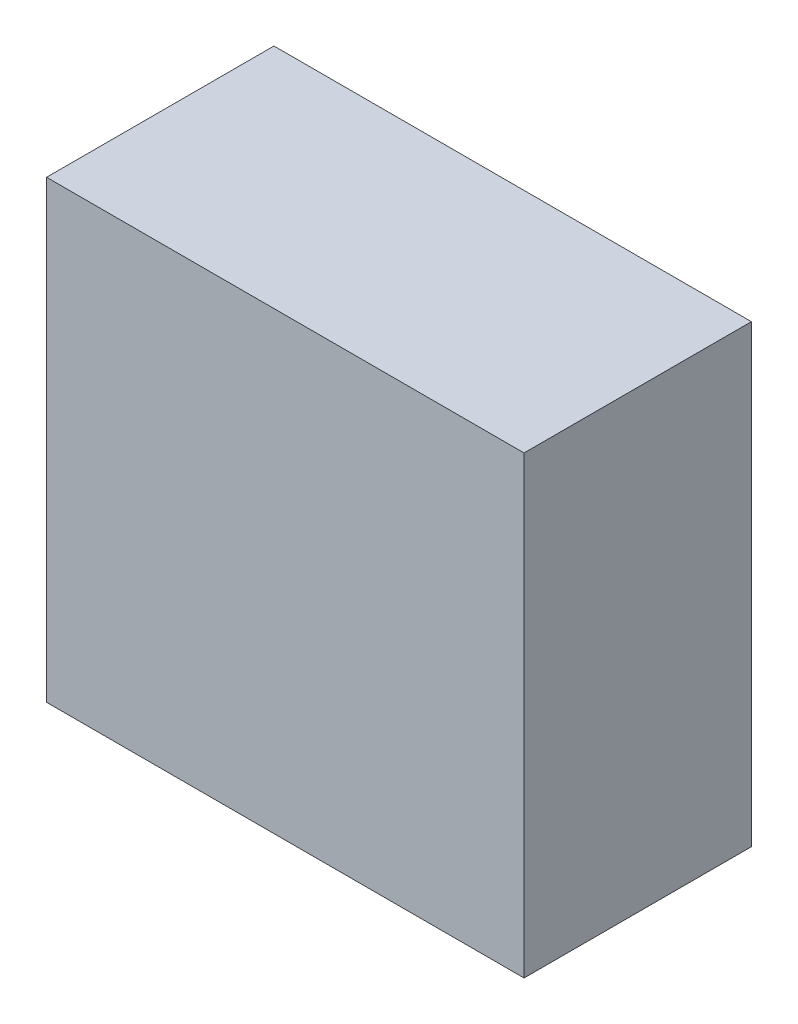
ISO-10303-21;
HEADER;
FILE_DESCRIPTION(('STEP AP214'),'2;1');
FILE_NAME('part.step','',(''),(''),'','','');
FILE_SCHEMA(('AUTOMOTIVE_DESIGN { 1 0 10303 214 1 1 1 1 }'));
ENDSEC;
DATA;
#1=APPLICATION_CONTEXT('core data for automotive mechanical design processes');
#2=APPLICATION_PROTOCOL_DEFINITION('international standard','automotive_design',2000,#1);
#3=PRODUCT_CONTEXT('',#1,'mechanical');
#4=PRODUCT('Part','Part','',(#3));
#5=PRODUCT_RELATED_PRODUCT_CATEGORY('part','',(#4));
#6=PRODUCT_DEFINITION_FORMATION('','',#4);
#7=PRODUCT_DEFINITION_CONTEXT('part definition',#1,'design');
#8=PRODUCT_DEFINITION('design','',#6,#7);
#9=PRODUCT_DEFINITION_SHAPE('','',#8);
#10=(LENGTH_UNIT() NAMED_UNIT(*) SI_UNIT(.MILLI.,.METRE.));
#11=(NAMED_UNIT(*) PLANE_ANGLE_UNIT() SI_UNIT($,.RADIAN.));
#12=(NAMED_UNIT(*) SI_UNIT($,.STERADIAN.) SOLID_ANGLE_UNIT());
#13=UNCERTAINTY_MEASURE_WITH_UNIT(LENGTH_MEASURE(1.E-05),#10,'distance_accuracy_value','');
#14=(GEOMETRIC_REPRESENTATION_CONTEXT(3) GLOBAL_UNCERTAINTY_ASSIGNED_CONTEXT((#13)) GLOBAL_UNIT_ASSIGNED_CONTEXT((#10,
#11,#12)) REPRESENTATION_CONTEXT('',''));
#15=CARTESIAN_POINT('',(0.,0.,0.));
#16=DIRECTION('',(0.,0.,1.));
#17=DIRECTION('',(1.,0.,0.));
#18=AXIS2_PLACEMENT_3D('',#15,#16,#17);
#19=CARTESIAN_POINT('',(0.,0.,10.));
#20=DIRECTION('',(1.,0.,0.));
#21=DIRECTION('',(0.,0.,-1.));
#22=AXIS2_PLACEMENT_3D('',#19,#20,#21);
#23=PLANE('',#22);
#24=DIRECTION('',(0.,-1.,0.));
#25=VECTOR('',#24,1.);
#26=CARTESIAN_POINT('',(0.,0.,0.));
#27=LINE('',#26,#25);
#28=CARTESIAN_POINT('',(0.,20.,0.));
#29=VERTEX_POINT('',#28);
#30=CARTESIAN_POINT('',(0.,0.,0.));
#31=VERTEX_POINT('',#30);
#32=EDGE_CURVE('E109',#29,#31,#27,.T.);
#33=ORIENTED_EDGE('',*,*,#32,.T.);
#34=DIRECTION('',(0.,0.,-1.));
#35=VECTOR('',#34,1.);
#36=CARTESIAN_POINT('',(0.,0.,10.));
#37=LINE('',#36,#35);
#38=CARTESIAN_POINT('',(0.,0.,10.));
#39=VERTEX_POINT('',#38);
#40=EDGE_CURVE('E11',#39,#31,#37,.T.);
#41=ORIENTED_EDGE('',*,*,#40,.F.);
#42=DIRECTION('',(0.,-1.,0.));
#43=VECTOR('',#42,1.);
#44=CARTESIAN_POINT('',(0.,0.,10.));
#45=LINE('',#44,#43);
#46=CARTESIAN_POINT('',(0.,20.,10.));
#47=VERTEX_POINT('',#46);
#48=EDGE_CURVE('E93',#47,#39,#45,.T.);
#49=ORIENTED_EDGE('',*,*,#48,.F.);
#50=DIRECTION('',(0.,0.,-1.));
#51=VECTOR('',#50,1.);
#52=CARTESIAN_POINT('',(0.,20.,10.));
#53=LINE('',#52,#51);
#54=EDGE_CURVE('E105',#47,#29,#53,.T.);
#55=ORIENTED_EDGE('',*,*,#54,.T.);
#56=EDGE_LOOP('',(#33,#41,#49,#55));
#57=FACE_BOUND('',#56,.T.);
#58=ADVANCED_FACE('F41',(#57),#23,.F.);
#59=CARTESIAN_POINT('',(0.,0.,10.));
#60=DIRECTION('',(0.,1.,0.));
#61=DIRECTION('',(0.,0.,1.));
#62=AXIS2_PLACEMENT_3D('',#59,#60,#61);
#63=PLANE('',#62);
#64=DIRECTION('',(1.,0.,0.));
#65=VECTOR('',#64,1.);
#66=CARTESIAN_POINT('',(0.,0.,0.));
#67=LINE('',#66,#65);
#68=CARTESIAN_POINT('',(21.,0.,0.));
#69=VERTEX_POINT('',#68);
#70=EDGE_CURVE('E98',#31,#69,#67,.T.);
#71=ORIENTED_EDGE('',*,*,#70,.T.);
#72=DIRECTION('',(0.,0.,-1.));
#73=VECTOR('',#72,1.);
#74=CARTESIAN_POINT('',(21.,0.,10.));
#75=LINE('',#74,#73);
#76=CARTESIAN_POINT('',(21.,0.,10.));
#77=VERTEX_POINT('',#76);
#78=EDGE_CURVE('E50',#77,#69,#75,.T.);
#79=ORIENTED_EDGE('',*,*,#78,.F.);
#80=DIRECTION('',(1.,0.,0.));
#81=VECTOR('',#80,1.);
#82=CARTESIAN_POINT('',(0.,0.,10.));
#83=LINE('',#82,#81);
#84=EDGE_CURVE('E88',#39,#77,#83,.T.);
#85=ORIENTED_EDGE('',*,*,#84,.F.);
#86=ORIENTED_EDGE('',*,*,#40,.T.);
#87=EDGE_LOOP('',(#71,#79,#85,#86));
#88=FACE_BOUND('',#87,.T.);
#89=ADVANCED_FACE('F97',(#88),#63,.F.);
#90=CARTESIAN_POINT('',(21.,0.,10.));
#91=DIRECTION('',(-1.,0.,0.));
#92=DIRECTION('',(0.,0.,1.));
#93=AXIS2_PLACEMENT_3D('',#90,#91,#92);
#94=PLANE('',#93);
#95=DIRECTION('',(0.,1.,0.));
#96=VECTOR('',#95,1.);
#97=CARTESIAN_POINT('',(21.,0.,0.));
#98=LINE('',#97,#96);
#99=CARTESIAN_POINT('',(21.,20.,0.));
#100=VERTEX_POINT('',#99);
#101=EDGE_CURVE('E75',#69,#100,#98,.T.);
#102=ORIENTED_EDGE('',*,*,#101,.T.);
#103=DIRECTION('',(0.,0.,-1.));
#104=VECTOR('',#103,1.);
#105=CARTESIAN_POINT('',(21.,20.,10.));
#106=LINE('',#105,#104);
#107=CARTESIAN_POINT('',(21.,20.,10.));
#108=VERTEX_POINT('',#107);
#109=EDGE_CURVE('E100',#108,#100,#106,.T.);
#110=ORIENTED_EDGE('',*,*,#109,.F.);
#111=DIRECTION('',(0.,1.,0.));
#112=VECTOR('',#111,1.);
#113=CARTESIAN_POINT('',(21.,0.,10.));
#114=LINE('',#113,#112);
#115=EDGE_CURVE('E91',#77,#108,#114,.T.);
#116=ORIENTED_EDGE('',*,*,#115,.F.);
#117=ORIENTED_EDGE('',*,*,#78,.T.);
#118=EDGE_LOOP('',(#102,#110,#116,#117));
#119=FACE_BOUND('',#118,.T.);
#120=ADVANCED_FACE('F101',(#119),#94,.F.);
#121=CARTESIAN_POINT('',(0.,20.,10.));
#122=DIRECTION('',(0.,-1.,0.));
#123=DIRECTION('',(0.,0.,-1.));
#124=AXIS2_PLACEMENT_3D('',#121,#122,#123);
#125=PLANE('',#124);
#126=DIRECTION('',(-1.,0.,0.));
#127=VECTOR('',#126,1.);
#128=CARTESIAN_POINT('',(0.,20.,0.));
#129=LINE('',#128,#127);
#130=EDGE_CURVE('E81',#100,#29,#129,.T.);
#131=ORIENTED_EDGE('',*,*,#130,.T.);
#132=ORIENTED_EDGE('',*,*,#54,.F.);
#133=DIRECTION('',(-1.,0.,0.));
#134=VECTOR('',#133,1.);
#135=CARTESIAN_POINT('',(0.,20.,10.));
#136=LINE('',#135,#134);
#137=EDGE_CURVE('E58',#108,#47,#136,.T.);
#138=ORIENTED_EDGE('',*,*,#137,.F.);
#139=ORIENTED_EDGE('',*,*,#109,.T.);
#140=EDGE_LOOP('',(#131,#132,#138,#139));
#141=FACE_BOUND('',#140,.T.);
#142=ADVANCED_FACE('F122',(#141),#125,.F.);
#143=CARTESIAN_POINT('',(0.,0.,10.));
#144=DIRECTION('',(0.,0.,-1.));
#145=DIRECTION('',(-1.,0.,0.));
#146=AXIS2_PLACEMENT_3D('',#143,#144,#145);
#147=PLANE('',#146);
#148=ORIENTED_EDGE('',*,*,#48,.T.);
#149=ORIENTED_EDGE('',*,*,#84,.T.);
#150=ORIENTED_EDGE('',*,*,#115,.T.);
#151=ORIENTED_EDGE('',*,*,#137,.T.);
#152=EDGE_LOOP('',(#148,#149,#150,#151));
#153=FACE_BOUND('',#152,.T.);
#154=ADVANCED_FACE('F89',(#153),#147,.F.);
#155=CARTESIAN_POINT('',(0.,0.,0.));
#156=DIRECTION('',(0.,0.,-1.));
#157=DIRECTION('',(-1.,0.,0.));
#158=AXIS2_PLACEMENT_3D('',#155,#156,#157);
#159=PLANE('',#158);
#160=ORIENTED_EDGE('',*,*,#32,.F.);
#161=ORIENTED_EDGE('',*,*,#130,.F.);
#162=ORIENTED_EDGE('',*,*,#101,.F.);
#163=ORIENTED_EDGE('',*,*,#70,.F.);
#164=EDGE_LOOP('',(#160,#161,#162,#163));
#165=FACE_BOUND('',#164,.T.);
#166=ADVANCED_FACE('F125',(#165),#159,.T.);
#167=CLOSED_SHELL('',(#58,#89,#120,#142,#154,#166));
#168=MANIFOLD_SOLID_BREP('B2',#167);
#169=ADVANCED_BREP_SHAPE_REPRESENTATION('',(#18,#168),#14);
#170=SHAPE_DEFINITION_REPRESENTATION(#9,#169);
ENDSEC;
END-ISO-10303-21;
